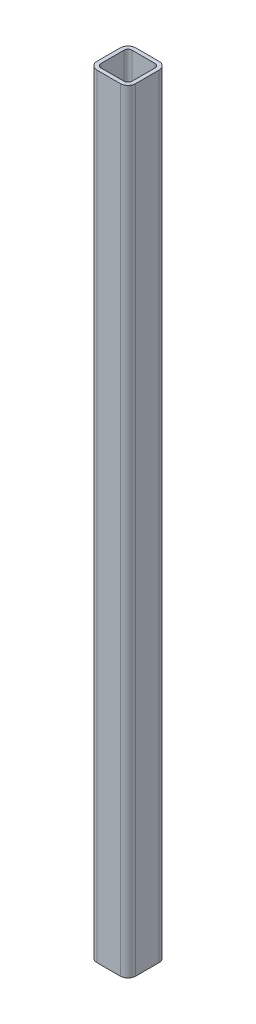
ISO-10303-21;
HEADER;
FILE_DESCRIPTION(('STEP AP214'),'2;1');
FILE_NAME('part.step','',(''),(''),'','','');
FILE_SCHEMA(('AUTOMOTIVE_DESIGN { 1 0 10303 214 1 1 1 1 }'));
ENDSEC;
DATA;
#1=APPLICATION_CONTEXT('core data for automotive mechanical design processes');
#2=APPLICATION_PROTOCOL_DEFINITION('international standard','automotive_design',2000,#1);
#3=PRODUCT_CONTEXT('',#1,'mechanical');
#4=PRODUCT('Part','Part','',(#3));
#5=PRODUCT_RELATED_PRODUCT_CATEGORY('part','',(#4));
#6=PRODUCT_DEFINITION_FORMATION('','',#4);
#7=PRODUCT_DEFINITION_CONTEXT('part definition',#1,'design');
#8=PRODUCT_DEFINITION('design','',#6,#7);
#9=PRODUCT_DEFINITION_SHAPE('','',#8);
#10=(LENGTH_UNIT() NAMED_UNIT(*) SI_UNIT(.MILLI.,.METRE.));
#11=(NAMED_UNIT(*) PLANE_ANGLE_UNIT() SI_UNIT($,.RADIAN.));
#12=(NAMED_UNIT(*) SI_UNIT($,.STERADIAN.) SOLID_ANGLE_UNIT());
#13=UNCERTAINTY_MEASURE_WITH_UNIT(LENGTH_MEASURE(1.E-05),#10,'distance_accuracy_value','');
#14=(GEOMETRIC_REPRESENTATION_CONTEXT(3) GLOBAL_UNCERTAINTY_ASSIGNED_CONTEXT((#13)) GLOBAL_UNIT_ASSIGNED_CONTEXT((#10,
#11,#12)) REPRESENTATION_CONTEXT('',''));
#15=CARTESIAN_POINT('',(0.,0.,0.));
#16=DIRECTION('',(0.,0.,1.));
#17=DIRECTION('',(1.,0.,0.));
#18=AXIS2_PLACEMENT_3D('',#15,#16,#17);
#19=CARTESIAN_POINT('',(12.,-800.,-12.0000000000001));
#20=DIRECTION('',(0.,1.,0.));
#21=DIRECTION('',(0.,0.,1.));
#22=AXIS2_PLACEMENT_3D('',#19,#20,#21);
#23=CYLINDRICAL_SURFACE('',#22,8.);
#24=CARTESIAN_POINT('',(12.,0.,-12.));
#25=DIRECTION('',(0.,-1.,0.));
#26=DIRECTION('',(0.,0.,-1.));
#27=AXIS2_PLACEMENT_3D('',#24,#25,#26);
#28=CIRCLE('',#27,8.);
#29=CARTESIAN_POINT('',(12.,0.,-20.));
#30=VERTEX_POINT('',#29);
#31=CARTESIAN_POINT('',(20.,0.,-12.));
#32=VERTEX_POINT('',#31);
#33=EDGE_CURVE('E252',#30,#32,#28,.T.);
#34=ORIENTED_EDGE('',*,*,#33,.T.);
#35=DIRECTION('',(0.,1.,0.));
#36=VECTOR('',#35,1.);
#37=CARTESIAN_POINT('',(20.,-800.,-12.0000000000001));
#38=LINE('',#37,#36);
#39=CARTESIAN_POINT('',(20.,-800.,-12.0000000000001));
#40=VERTEX_POINT('',#39);
#41=EDGE_CURVE('E12',#40,#32,#38,.T.);
#42=ORIENTED_EDGE('',*,*,#41,.F.);
#43=CARTESIAN_POINT('',(12.,-800.,-12.0000000000001));
#44=DIRECTION('',(0.,-1.,0.));
#45=DIRECTION('',(0.,0.,-1.));
#46=AXIS2_PLACEMENT_3D('',#43,#44,#45);
#47=CIRCLE('',#46,8.);
#48=CARTESIAN_POINT('',(12.,-800.,-20.0000000000001));
#49=VERTEX_POINT('',#48);
#50=EDGE_CURVE('E358',#49,#40,#47,.T.);
#51=ORIENTED_EDGE('',*,*,#50,.F.);
#52=DIRECTION('',(0.,1.,0.));
#53=VECTOR('',#52,1.);
#54=CARTESIAN_POINT('',(12.,-800.,-20.0000000000001));
#55=LINE('',#54,#53);
#56=EDGE_CURVE('E275',#49,#30,#55,.T.);
#57=ORIENTED_EDGE('',*,*,#56,.T.);
#58=EDGE_LOOP('',(#34,#42,#51,#57));
#59=FACE_BOUND('',#58,.T.);
#60=ADVANCED_FACE('F67',(#59),#23,.T.);
#61=CARTESIAN_POINT('',(20.,-800.,-12.0000000000001));
#62=DIRECTION('',(-1.,0.,0.));
#63=DIRECTION('',(0.,0.,1.));
#64=AXIS2_PLACEMENT_3D('',#61,#62,#63);
#65=PLANE('',#64);
#66=DIRECTION('',(0.,0.,1.));
#67=VECTOR('',#66,1.);
#68=CARTESIAN_POINT('',(20.,0.,-12.));
#69=LINE('',#68,#67);
#70=CARTESIAN_POINT('',(20.,0.,12.));
#71=VERTEX_POINT('',#70);
#72=EDGE_CURVE('E256',#32,#71,#69,.T.);
#73=ORIENTED_EDGE('',*,*,#72,.T.);
#74=DIRECTION('',(0.,1.,0.));
#75=VECTOR('',#74,1.);
#76=CARTESIAN_POINT('',(20.,-800.,11.9999999999999));
#77=LINE('',#76,#75);
#78=CARTESIAN_POINT('',(20.,-800.,11.9999999999999));
#79=VERTEX_POINT('',#78);
#80=EDGE_CURVE('E78',#79,#71,#77,.T.);
#81=ORIENTED_EDGE('',*,*,#80,.F.);
#82=DIRECTION('',(0.,0.,1.));
#83=VECTOR('',#82,1.);
#84=CARTESIAN_POINT('',(20.,-800.,-12.0000000000001));
#85=LINE('',#84,#83);
#86=EDGE_CURVE('E361',#40,#79,#85,.T.);
#87=ORIENTED_EDGE('',*,*,#86,.F.);
#88=ORIENTED_EDGE('',*,*,#41,.T.);
#89=EDGE_LOOP('',(#73,#81,#87,#88));
#90=FACE_BOUND('',#89,.T.);
#91=ADVANCED_FACE('F400',(#90),#65,.F.);
#92=CARTESIAN_POINT('',(12.,-800.,11.9999999999999));
#93=DIRECTION('',(0.,1.,0.));
#94=DIRECTION('',(0.,0.,1.));
#95=AXIS2_PLACEMENT_3D('',#92,#93,#94);
#96=CYLINDRICAL_SURFACE('',#95,8.);
#97=CARTESIAN_POINT('',(12.,0.,12.));
#98=DIRECTION('',(0.,-1.,0.));
#99=DIRECTION('',(0.,0.,-1.));
#100=AXIS2_PLACEMENT_3D('',#97,#98,#99);
#101=CIRCLE('',#100,8.);
#102=CARTESIAN_POINT('',(12.,0.,20.));
#103=VERTEX_POINT('',#102);
#104=EDGE_CURVE('E259',#71,#103,#101,.T.);
#105=ORIENTED_EDGE('',*,*,#104,.T.);
#106=DIRECTION('',(0.,1.,0.));
#107=VECTOR('',#106,1.);
#108=CARTESIAN_POINT('',(12.,-800.,19.9999999999999));
#109=LINE('',#108,#107);
#110=CARTESIAN_POINT('',(12.,-800.,19.9999999999999));
#111=VERTEX_POINT('',#110);
#112=EDGE_CURVE('E286',#111,#103,#109,.T.);
#113=ORIENTED_EDGE('',*,*,#112,.F.);
#114=CARTESIAN_POINT('',(12.,-800.,11.9999999999999));
#115=DIRECTION('',(0.,-1.,0.));
#116=DIRECTION('',(0.,0.,-1.));
#117=AXIS2_PLACEMENT_3D('',#114,#115,#116);
#118=CIRCLE('',#117,8.);
#119=EDGE_CURVE('E364',#79,#111,#118,.T.);
#120=ORIENTED_EDGE('',*,*,#119,.F.);
#121=ORIENTED_EDGE('',*,*,#80,.T.);
#122=EDGE_LOOP('',(#105,#113,#120,#121));
#123=FACE_BOUND('',#122,.T.);
#124=ADVANCED_FACE('F405',(#123),#96,.T.);
#125=CARTESIAN_POINT('',(-12.,-800.,19.9999999999999));
#126=DIRECTION('',(0.,0.,-1.));
#127=DIRECTION('',(0.,1.,0.));
#128=AXIS2_PLACEMENT_3D('',#125,#126,#127);
#129=PLANE('',#128);
#130=DIRECTION('',(-1.,0.,0.));
#131=VECTOR('',#130,1.);
#132=CARTESIAN_POINT('',(-12.,0.,20.));
#133=LINE('',#132,#131);
#134=CARTESIAN_POINT('',(-12.,0.,20.));
#135=VERTEX_POINT('',#134);
#136=EDGE_CURVE('E262',#103,#135,#133,.T.);
#137=ORIENTED_EDGE('',*,*,#136,.T.);
#138=DIRECTION('',(0.,1.,0.));
#139=VECTOR('',#138,1.);
#140=CARTESIAN_POINT('',(-12.,-800.,19.9999999999999));
#141=LINE('',#140,#139);
#142=CARTESIAN_POINT('',(-12.,-800.,19.9999999999999));
#143=VERTEX_POINT('',#142);
#144=EDGE_CURVE('E282',#143,#135,#141,.T.);
#145=ORIENTED_EDGE('',*,*,#144,.F.);
#146=DIRECTION('',(-1.,0.,0.));
#147=VECTOR('',#146,1.);
#148=CARTESIAN_POINT('',(-12.,-800.,19.9999999999999));
#149=LINE('',#148,#147);
#150=EDGE_CURVE('E367',#111,#143,#149,.T.);
#151=ORIENTED_EDGE('',*,*,#150,.F.);
#152=ORIENTED_EDGE('',*,*,#112,.T.);
#153=EDGE_LOOP('',(#137,#145,#151,#152));
#154=FACE_BOUND('',#153,.T.);
#155=ADVANCED_FACE('F375',(#154),#129,.F.);
#156=CARTESIAN_POINT('',(-12.,-800.,11.9999999999999));
#157=DIRECTION('',(0.,1.,0.));
#158=DIRECTION('',(0.,0.,1.));
#159=AXIS2_PLACEMENT_3D('',#156,#157,#158);
#160=CYLINDRICAL_SURFACE('',#159,8.);
#161=CARTESIAN_POINT('',(-12.,0.,12.));
#162=DIRECTION('',(0.,-1.,0.));
#163=DIRECTION('',(0.,0.,-1.));
#164=AXIS2_PLACEMENT_3D('',#161,#162,#163);
#165=CIRCLE('',#164,8.);
#166=CARTESIAN_POINT('',(-20.,0.,12.));
#167=VERTEX_POINT('',#166);
#168=EDGE_CURVE('E265',#135,#167,#165,.T.);
#169=ORIENTED_EDGE('',*,*,#168,.T.);
#170=DIRECTION('',(0.,1.,0.));
#171=VECTOR('',#170,1.);
#172=CARTESIAN_POINT('',(-20.,-800.,11.9999999999999));
#173=LINE('',#172,#171);
#174=CARTESIAN_POINT('',(-20.,-800.,11.9999999999999));
#175=VERTEX_POINT('',#174);
#176=EDGE_CURVE('E209',#175,#167,#173,.T.);
#177=ORIENTED_EDGE('',*,*,#176,.F.);
#178=CARTESIAN_POINT('',(-12.,-800.,11.9999999999999));
#179=DIRECTION('',(0.,-1.,0.));
#180=DIRECTION('',(0.,0.,-1.));
#181=AXIS2_PLACEMENT_3D('',#178,#179,#180);
#182=CIRCLE('',#181,8.);
#183=EDGE_CURVE('E198',#143,#175,#182,.T.);
#184=ORIENTED_EDGE('',*,*,#183,.F.);
#185=ORIENTED_EDGE('',*,*,#144,.T.);
#186=EDGE_LOOP('',(#169,#177,#184,#185));
#187=FACE_BOUND('',#186,.T.);
#188=ADVANCED_FACE('F379',(#187),#160,.T.);
#189=CARTESIAN_POINT('',(-20.,-800.,11.9999999999999));
#190=DIRECTION('',(1.,0.,0.));
#191=DIRECTION('',(0.,0.,-1.));
#192=AXIS2_PLACEMENT_3D('',#189,#190,#191);
#193=PLANE('',#192);
#194=DIRECTION('',(0.,0.,-1.));
#195=VECTOR('',#194,1.);
#196=CARTESIAN_POINT('',(-20.,0.,12.));
#197=LINE('',#196,#195);
#198=CARTESIAN_POINT('',(-20.,0.,-12.));
#199=VERTEX_POINT('',#198);
#200=EDGE_CURVE('E207',#167,#199,#197,.T.);
#201=ORIENTED_EDGE('',*,*,#200,.T.);
#202=DIRECTION('',(0.,1.,0.));
#203=VECTOR('',#202,1.);
#204=CARTESIAN_POINT('',(-20.,-800.,-12.0000000000001));
#205=LINE('',#204,#203);
#206=CARTESIAN_POINT('',(-20.,-800.,-12.0000000000001));
#207=VERTEX_POINT('',#206);
#208=EDGE_CURVE('E204',#207,#199,#205,.T.);
#209=ORIENTED_EDGE('',*,*,#208,.F.);
#210=DIRECTION('',(0.,0.,-1.));
#211=VECTOR('',#210,1.);
#212=CARTESIAN_POINT('',(-20.,-800.,11.9999999999999));
#213=LINE('',#212,#211);
#214=EDGE_CURVE('E192',#175,#207,#213,.T.);
#215=ORIENTED_EDGE('',*,*,#214,.F.);
#216=ORIENTED_EDGE('',*,*,#176,.T.);
#217=EDGE_LOOP('',(#201,#209,#215,#216));
#218=FACE_BOUND('',#217,.T.);
#219=ADVANCED_FACE('F205',(#218),#193,.F.);
#220=CARTESIAN_POINT('',(-12.,-800.,-12.0000000000001));
#221=DIRECTION('',(0.,1.,0.));
#222=DIRECTION('',(0.,0.,1.));
#223=AXIS2_PLACEMENT_3D('',#220,#221,#222);
#224=CYLINDRICAL_SURFACE('',#223,8.);
#225=CARTESIAN_POINT('',(-12.,0.,-12.));
#226=DIRECTION('',(0.,-1.,0.));
#227=DIRECTION('',(0.,0.,-1.));
#228=AXIS2_PLACEMENT_3D('',#225,#226,#227);
#229=CIRCLE('',#228,8.);
#230=CARTESIAN_POINT('',(-12.,0.,-20.));
#231=VERTEX_POINT('',#230);
#232=EDGE_CURVE('E140',#199,#231,#229,.T.);
#233=ORIENTED_EDGE('',*,*,#232,.T.);
#234=DIRECTION('',(0.,1.,0.));
#235=VECTOR('',#234,1.);
#236=CARTESIAN_POINT('',(-12.,-800.,-20.0000000000001));
#237=LINE('',#236,#235);
#238=CARTESIAN_POINT('',(-12.,-800.,-20.0000000000001));
#239=VERTEX_POINT('',#238);
#240=EDGE_CURVE('E210',#239,#231,#237,.T.);
#241=ORIENTED_EDGE('',*,*,#240,.F.);
#242=CARTESIAN_POINT('',(-12.,-800.,-12.0000000000001));
#243=DIRECTION('',(0.,-1.,0.));
#244=DIRECTION('',(0.,0.,-1.));
#245=AXIS2_PLACEMENT_3D('',#242,#243,#244);
#246=CIRCLE('',#245,8.);
#247=EDGE_CURVE('E196',#207,#239,#246,.T.);
#248=ORIENTED_EDGE('',*,*,#247,.F.);
#249=ORIENTED_EDGE('',*,*,#208,.T.);
#250=EDGE_LOOP('',(#233,#241,#248,#249));
#251=FACE_BOUND('',#250,.T.);
#252=ADVANCED_FACE('F212',(#251),#224,.T.);
#253=CARTESIAN_POINT('',(12.,-800.,11.9999999999999));
#254=DIRECTION('',(0.,1.,0.));
#255=DIRECTION('',(0.,0.,1.));
#256=AXIS2_PLACEMENT_3D('',#253,#254,#255);
#257=CYLINDRICAL_SURFACE('',#256,4.);
#258=CARTESIAN_POINT('',(12.,0.,12.));
#259=DIRECTION('',(0.,-1.,0.));
#260=DIRECTION('',(0.,0.,-1.));
#261=AXIS2_PLACEMENT_3D('',#258,#259,#260);
#262=CIRCLE('',#261,4.);
#263=CARTESIAN_POINT('',(16.,0.,12.));
#264=VERTEX_POINT('',#263);
#265=CARTESIAN_POINT('',(12.,0.,16.));
#266=VERTEX_POINT('',#265);
#267=EDGE_CURVE('E220',#264,#266,#262,.T.);
#268=ORIENTED_EDGE('',*,*,#267,.F.);
#269=DIRECTION('',(0.,1.,0.));
#270=VECTOR('',#269,1.);
#271=CARTESIAN_POINT('',(16.,-800.,11.9999999999999));
#272=LINE('',#271,#270);
#273=CARTESIAN_POINT('',(16.,-800.,11.9999999999999));
#274=VERTEX_POINT('',#273);
#275=EDGE_CURVE('E71',#274,#264,#272,.T.);
#276=ORIENTED_EDGE('',*,*,#275,.F.);
#277=CARTESIAN_POINT('',(12.,-800.,11.9999999999999));
#278=DIRECTION('',(0.,-1.,0.));
#279=DIRECTION('',(0.,0.,-1.));
#280=AXIS2_PLACEMENT_3D('',#277,#278,#279);
#281=CIRCLE('',#280,4.);
#282=CARTESIAN_POINT('',(12.,-800.,15.9999999999999));
#283=VERTEX_POINT('',#282);
#284=EDGE_CURVE('E274',#274,#283,#281,.T.);
#285=ORIENTED_EDGE('',*,*,#284,.T.);
#286=DIRECTION('',(0.,1.,0.));
#287=VECTOR('',#286,1.);
#288=CARTESIAN_POINT('',(12.,-800.,15.9999999999999));
#289=LINE('',#288,#287);
#290=EDGE_CURVE('E216',#283,#266,#289,.T.);
#291=ORIENTED_EDGE('',*,*,#290,.T.);
#292=EDGE_LOOP('',(#268,#276,#285,#291));
#293=FACE_BOUND('',#292,.T.);
#294=ADVANCED_FACE('F69',(#293),#257,.F.);
#295=CARTESIAN_POINT('',(16.,-800.,-12.0000000000001));
#296=DIRECTION('',(-1.,0.,0.));
#297=DIRECTION('',(0.,0.,1.));
#298=AXIS2_PLACEMENT_3D('',#295,#296,#297);
#299=PLANE('',#298);
#300=DIRECTION('',(0.,0.,1.));
#301=VECTOR('',#300,1.);
#302=CARTESIAN_POINT('',(16.,0.,-12.));
#303=LINE('',#302,#301);
#304=CARTESIAN_POINT('',(16.,0.,-12.));
#305=VERTEX_POINT('',#304);
#306=EDGE_CURVE('E224',#305,#264,#303,.T.);
#307=ORIENTED_EDGE('',*,*,#306,.F.);
#308=DIRECTION('',(0.,1.,0.));
#309=VECTOR('',#308,1.);
#310=CARTESIAN_POINT('',(16.,-800.,-12.0000000000001));
#311=LINE('',#310,#309);
#312=CARTESIAN_POINT('',(16.,-800.,-12.0000000000001));
#313=VERTEX_POINT('',#312);
#314=EDGE_CURVE('E309',#313,#305,#311,.T.);
#315=ORIENTED_EDGE('',*,*,#314,.F.);
#316=DIRECTION('',(0.,0.,1.));
#317=VECTOR('',#316,1.);
#318=CARTESIAN_POINT('',(16.,-800.,-12.0000000000001));
#319=LINE('',#318,#317);
#320=EDGE_CURVE('E320',#313,#274,#319,.T.);
#321=ORIENTED_EDGE('',*,*,#320,.T.);
#322=ORIENTED_EDGE('',*,*,#275,.T.);
#323=EDGE_LOOP('',(#307,#315,#321,#322));
#324=FACE_BOUND('',#323,.T.);
#325=ADVANCED_FACE('F318',(#324),#299,.T.);
#326=CARTESIAN_POINT('',(12.,-800.,-12.0000000000001));
#327=DIRECTION('',(0.,1.,0.));
#328=DIRECTION('',(0.,0.,1.));
#329=AXIS2_PLACEMENT_3D('',#326,#327,#328);
#330=CYLINDRICAL_SURFACE('',#329,4.);
#331=CARTESIAN_POINT('',(12.,0.,-12.));
#332=DIRECTION('',(0.,-1.,0.));
#333=DIRECTION('',(0.,0.,-1.));
#334=AXIS2_PLACEMENT_3D('',#331,#332,#333);
#335=CIRCLE('',#334,4.);
#336=CARTESIAN_POINT('',(12.,0.,-16.));
#337=VERTEX_POINT('',#336);
#338=EDGE_CURVE('E228',#337,#305,#335,.T.);
#339=ORIENTED_EDGE('',*,*,#338,.F.);
#340=DIRECTION('',(0.,1.,0.));
#341=VECTOR('',#340,1.);
#342=CARTESIAN_POINT('',(12.,-800.,-16.0000000000001));
#343=LINE('',#342,#341);
#344=CARTESIAN_POINT('',(12.,-800.,-16.0000000000001));
#345=VERTEX_POINT('',#344);
#346=EDGE_CURVE('E307',#345,#337,#343,.T.);
#347=ORIENTED_EDGE('',*,*,#346,.F.);
#348=CARTESIAN_POINT('',(12.,-800.,-12.0000000000001));
#349=DIRECTION('',(0.,-1.,0.));
#350=DIRECTION('',(0.,0.,-1.));
#351=AXIS2_PLACEMENT_3D('',#348,#349,#350);
#352=CIRCLE('',#351,4.);
#353=EDGE_CURVE('E328',#345,#313,#352,.T.);
#354=ORIENTED_EDGE('',*,*,#353,.T.);
#355=ORIENTED_EDGE('',*,*,#314,.T.);
#356=EDGE_LOOP('',(#339,#347,#354,#355));
#357=FACE_BOUND('',#356,.T.);
#358=ADVANCED_FACE('F326',(#357),#330,.F.);
#359=CARTESIAN_POINT('',(12.,-800.,-16.0000000000001));
#360=DIRECTION('',(0.,0.,1.));
#361=DIRECTION('',(0.,-1.,0.));
#362=AXIS2_PLACEMENT_3D('',#359,#360,#361);
#363=PLANE('',#362);
#364=DIRECTION('',(1.,0.,0.));
#365=VECTOR('',#364,1.);
#366=CARTESIAN_POINT('',(12.,0.,-16.));
#367=LINE('',#366,#365);
#368=CARTESIAN_POINT('',(-12.,0.,-16.));
#369=VERTEX_POINT('',#368);
#370=EDGE_CURVE('E232',#369,#337,#367,.T.);
#371=ORIENTED_EDGE('',*,*,#370,.F.);
#372=DIRECTION('',(0.,1.,0.));
#373=VECTOR('',#372,1.);
#374=CARTESIAN_POINT('',(-12.,-800.,-16.0000000000001));
#375=LINE('',#374,#373);
#376=CARTESIAN_POINT('',(-12.,-800.,-16.0000000000001));
#377=VERTEX_POINT('',#376);
#378=EDGE_CURVE('E304',#377,#369,#375,.T.);
#379=ORIENTED_EDGE('',*,*,#378,.F.);
#380=DIRECTION('',(1.,0.,0.));
#381=VECTOR('',#380,1.);
#382=CARTESIAN_POINT('',(12.,-800.,-16.0000000000001));
#383=LINE('',#382,#381);
#384=EDGE_CURVE('E334',#377,#345,#383,.T.);
#385=ORIENTED_EDGE('',*,*,#384,.T.);
#386=ORIENTED_EDGE('',*,*,#346,.T.);
#387=EDGE_LOOP('',(#371,#379,#385,#386));
#388=FACE_BOUND('',#387,.T.);
#389=ADVANCED_FACE('F338',(#388),#363,.T.);
#390=CARTESIAN_POINT('',(-12.,-800.,-12.0000000000001));
#391=DIRECTION('',(0.,1.,0.));
#392=DIRECTION('',(0.,0.,1.));
#393=AXIS2_PLACEMENT_3D('',#390,#391,#392);
#394=CYLINDRICAL_SURFACE('',#393,3.99999999999999);
#395=CARTESIAN_POINT('',(-12.,0.,-12.));
#396=DIRECTION('',(0.,-1.,0.));
#397=DIRECTION('',(0.,0.,-1.));
#398=AXIS2_PLACEMENT_3D('',#395,#396,#397);
#399=CIRCLE('',#398,3.99999999999999);
#400=CARTESIAN_POINT('',(-16.,0.,-12.));
#401=VERTEX_POINT('',#400);
#402=EDGE_CURVE('E236',#401,#369,#399,.T.);
#403=ORIENTED_EDGE('',*,*,#402,.F.);
#404=DIRECTION('',(0.,1.,0.));
#405=VECTOR('',#404,1.);
#406=CARTESIAN_POINT('',(-16.,-800.,-12.0000000000001));
#407=LINE('',#406,#405);
#408=CARTESIAN_POINT('',(-16.,-800.,-12.0000000000001));
#409=VERTEX_POINT('',#408);
#410=EDGE_CURVE('E301',#409,#401,#407,.T.);
#411=ORIENTED_EDGE('',*,*,#410,.F.);
#412=CARTESIAN_POINT('',(-12.,-800.,-12.0000000000001));
#413=DIRECTION('',(0.,-1.,0.));
#414=DIRECTION('',(0.,0.,-1.));
#415=AXIS2_PLACEMENT_3D('',#412,#413,#414);
#416=CIRCLE('',#415,3.99999999999999);
#417=EDGE_CURVE('E340',#409,#377,#416,.T.);
#418=ORIENTED_EDGE('',*,*,#417,.T.);
#419=ORIENTED_EDGE('',*,*,#378,.T.);
#420=EDGE_LOOP('',(#403,#411,#418,#419));
#421=FACE_BOUND('',#420,.T.);
#422=ADVANCED_FACE('F416',(#421),#394,.F.);
#423=CARTESIAN_POINT('',(-16.,-800.,11.9999999999999));
#424=DIRECTION('',(1.,0.,0.));
#425=DIRECTION('',(0.,0.,-1.));
#426=AXIS2_PLACEMENT_3D('',#423,#424,#425);
#427=PLANE('',#426);
#428=DIRECTION('',(0.,0.,-1.));
#429=VECTOR('',#428,1.);
#430=CARTESIAN_POINT('',(-16.,0.,12.));
#431=LINE('',#430,#429);
#432=CARTESIAN_POINT('',(-16.,0.,12.));
#433=VERTEX_POINT('',#432);
#434=EDGE_CURVE('E240',#433,#401,#431,.T.);
#435=ORIENTED_EDGE('',*,*,#434,.F.);
#436=DIRECTION('',(0.,1.,0.));
#437=VECTOR('',#436,1.);
#438=CARTESIAN_POINT('',(-16.,-800.,11.9999999999999));
#439=LINE('',#438,#437);
#440=CARTESIAN_POINT('',(-16.,-800.,11.9999999999999));
#441=VERTEX_POINT('',#440);
#442=EDGE_CURVE('E298',#441,#433,#439,.T.);
#443=ORIENTED_EDGE('',*,*,#442,.F.);
#444=DIRECTION('',(0.,0.,-1.));
#445=VECTOR('',#444,1.);
#446=CARTESIAN_POINT('',(-16.,-800.,11.9999999999999));
#447=LINE('',#446,#445);
#448=EDGE_CURVE('E343',#441,#409,#447,.T.);
#449=ORIENTED_EDGE('',*,*,#448,.T.);
#450=ORIENTED_EDGE('',*,*,#410,.T.);
#451=EDGE_LOOP('',(#435,#443,#449,#450));
#452=FACE_BOUND('',#451,.T.);
#453=ADVANCED_FACE('F412',(#452),#427,.T.);
#454=CARTESIAN_POINT('',(-12.,-800.,11.9999999999999));
#455=DIRECTION('',(0.,1.,0.));
#456=DIRECTION('',(0.,0.,1.));
#457=AXIS2_PLACEMENT_3D('',#454,#455,#456);
#458=CYLINDRICAL_SURFACE('',#457,4.);
#459=CARTESIAN_POINT('',(-12.,0.,12.));
#460=DIRECTION('',(0.,-1.,0.));
#461=DIRECTION('',(0.,0.,-1.));
#462=AXIS2_PLACEMENT_3D('',#459,#460,#461);
#463=CIRCLE('',#462,4.);
#464=CARTESIAN_POINT('',(-12.,0.,16.));
#465=VERTEX_POINT('',#464);
#466=EDGE_CURVE('E244',#465,#433,#463,.T.);
#467=ORIENTED_EDGE('',*,*,#466,.F.);
#468=DIRECTION('',(0.,1.,0.));
#469=VECTOR('',#468,1.);
#470=CARTESIAN_POINT('',(-12.,-800.,15.9999999999999));
#471=LINE('',#470,#469);
#472=CARTESIAN_POINT('',(-12.,-800.,15.9999999999999));
#473=VERTEX_POINT('',#472);
#474=EDGE_CURVE('E295',#473,#465,#471,.T.);
#475=ORIENTED_EDGE('',*,*,#474,.F.);
#476=CARTESIAN_POINT('',(-12.,-800.,11.9999999999999));
#477=DIRECTION('',(0.,-1.,0.));
#478=DIRECTION('',(0.,0.,-1.));
#479=AXIS2_PLACEMENT_3D('',#476,#477,#478);
#480=CIRCLE('',#479,4.);
#481=EDGE_CURVE('E350',#473,#441,#480,.T.);
#482=ORIENTED_EDGE('',*,*,#481,.T.);
#483=ORIENTED_EDGE('',*,*,#442,.T.);
#484=EDGE_LOOP('',(#467,#475,#482,#483));
#485=FACE_BOUND('',#484,.T.);
#486=ADVANCED_FACE('F394',(#485),#458,.F.);
#487=CARTESIAN_POINT('',(-12.,-800.,15.9999999999999));
#488=DIRECTION('',(0.,0.,-1.));
#489=DIRECTION('',(0.,1.,0.));
#490=AXIS2_PLACEMENT_3D('',#487,#488,#489);
#491=PLANE('',#490);
#492=DIRECTION('',(-1.,0.,0.));
#493=VECTOR('',#492,1.);
#494=CARTESIAN_POINT('',(-12.,0.,16.));
#495=LINE('',#494,#493);
#496=EDGE_CURVE('E248',#266,#465,#495,.T.);
#497=ORIENTED_EDGE('',*,*,#496,.F.);
#498=ORIENTED_EDGE('',*,*,#290,.F.);
#499=DIRECTION('',(-1.,0.,0.));
#500=VECTOR('',#499,1.);
#501=CARTESIAN_POINT('',(-12.,-800.,15.9999999999999));
#502=LINE('',#501,#500);
#503=EDGE_CURVE('E354',#283,#473,#502,.T.);
#504=ORIENTED_EDGE('',*,*,#503,.T.);
#505=ORIENTED_EDGE('',*,*,#474,.T.);
#506=EDGE_LOOP('',(#497,#498,#504,#505));
#507=FACE_BOUND('',#506,.T.);
#508=ADVANCED_FACE('F387',(#507),#491,.T.);
#509=CARTESIAN_POINT('',(12.,-800.,-20.0000000000001));
#510=DIRECTION('',(0.,0.,1.));
#511=DIRECTION('',(0.,-1.,0.));
#512=AXIS2_PLACEMENT_3D('',#509,#510,#511);
#513=PLANE('',#512);
#514=DIRECTION('',(1.,0.,0.));
#515=VECTOR('',#514,1.);
#516=CARTESIAN_POINT('',(12.,0.,-20.));
#517=LINE('',#516,#515);
#518=EDGE_CURVE('E146',#231,#30,#517,.T.);
#519=ORIENTED_EDGE('',*,*,#518,.T.);
#520=ORIENTED_EDGE('',*,*,#56,.F.);
#521=DIRECTION('',(1.,0.,0.));
#522=VECTOR('',#521,1.);
#523=CARTESIAN_POINT('',(12.,-800.,-20.0000000000001));
#524=LINE('',#523,#522);
#525=EDGE_CURVE('E87',#239,#49,#524,.T.);
#526=ORIENTED_EDGE('',*,*,#525,.F.);
#527=ORIENTED_EDGE('',*,*,#240,.T.);
#528=EDGE_LOOP('',(#519,#520,#526,#527));
#529=FACE_BOUND('',#528,.T.);
#530=ADVANCED_FACE('F385',(#529),#513,.F.);
#531=CARTESIAN_POINT('',(12.,-800.,-12.0000000000001));
#532=DIRECTION('',(0.,-1.,0.));
#533=DIRECTION('',(0.,0.,-1.));
#534=AXIS2_PLACEMENT_3D('',#531,#532,#533);
#535=PLANE('',#534);
#536=ORIENTED_EDGE('',*,*,#284,.F.);
#537=ORIENTED_EDGE('',*,*,#320,.F.);
#538=ORIENTED_EDGE('',*,*,#353,.F.);
#539=ORIENTED_EDGE('',*,*,#384,.F.);
#540=ORIENTED_EDGE('',*,*,#417,.F.);
#541=ORIENTED_EDGE('',*,*,#448,.F.);
#542=ORIENTED_EDGE('',*,*,#481,.F.);
#543=ORIENTED_EDGE('',*,*,#503,.F.);
#544=EDGE_LOOP('',(#536,#537,#538,#539,#540,#541,#542,#543));
#545=FACE_BOUND('',#544,.T.);
#546=ORIENTED_EDGE('',*,*,#50,.T.);
#547=ORIENTED_EDGE('',*,*,#86,.T.);
#548=ORIENTED_EDGE('',*,*,#119,.T.);
#549=ORIENTED_EDGE('',*,*,#150,.T.);
#550=ORIENTED_EDGE('',*,*,#183,.T.);
#551=ORIENTED_EDGE('',*,*,#214,.T.);
#552=ORIENTED_EDGE('',*,*,#247,.T.);
#553=ORIENTED_EDGE('',*,*,#525,.T.);
#554=EDGE_LOOP('',(#546,#547,#548,#549,#550,#551,#552,#553));
#555=FACE_BOUND('',#554,.T.);
#556=ADVANCED_FACE('F194',(#545,#555),#535,.T.);
#557=CARTESIAN_POINT('',(12.,0.,-12.));
#558=DIRECTION('',(0.,-1.,0.));
#559=DIRECTION('',(0.,0.,-1.));
#560=AXIS2_PLACEMENT_3D('',#557,#558,#559);
#561=PLANE('',#560);
#562=ORIENTED_EDGE('',*,*,#267,.T.);
#563=ORIENTED_EDGE('',*,*,#496,.T.);
#564=ORIENTED_EDGE('',*,*,#466,.T.);
#565=ORIENTED_EDGE('',*,*,#434,.T.);
#566=ORIENTED_EDGE('',*,*,#402,.T.);
#567=ORIENTED_EDGE('',*,*,#370,.T.);
#568=ORIENTED_EDGE('',*,*,#338,.T.);
#569=ORIENTED_EDGE('',*,*,#306,.T.);
#570=EDGE_LOOP('',(#562,#563,#564,#565,#566,#567,#568,#569));
#571=FACE_BOUND('',#570,.T.);
#572=ORIENTED_EDGE('',*,*,#33,.F.);
#573=ORIENTED_EDGE('',*,*,#518,.F.);
#574=ORIENTED_EDGE('',*,*,#232,.F.);
#575=ORIENTED_EDGE('',*,*,#200,.F.);
#576=ORIENTED_EDGE('',*,*,#168,.F.);
#577=ORIENTED_EDGE('',*,*,#136,.F.);
#578=ORIENTED_EDGE('',*,*,#104,.F.);
#579=ORIENTED_EDGE('',*,*,#72,.F.);
#580=EDGE_LOOP('',(#572,#573,#574,#575,#576,#577,#578,#579));
#581=FACE_BOUND('',#580,.T.);
#582=ADVANCED_FACE('F323',(#571,#581),#561,.F.);
#583=CLOSED_SHELL('',(#60,#91,#124,#155,#188,#219,#252,#294,#325,#358,#389,#422,#453,#486,#508,
#530,#556,#582));
#584=MANIFOLD_SOLID_BREP('B2',#583);
#585=ADVANCED_BREP_SHAPE_REPRESENTATION('',(#18,#584),#14);
#586=SHAPE_DEFINITION_REPRESENTATION(#9,#585);
ENDSEC;
END-ISO-10303-21;
